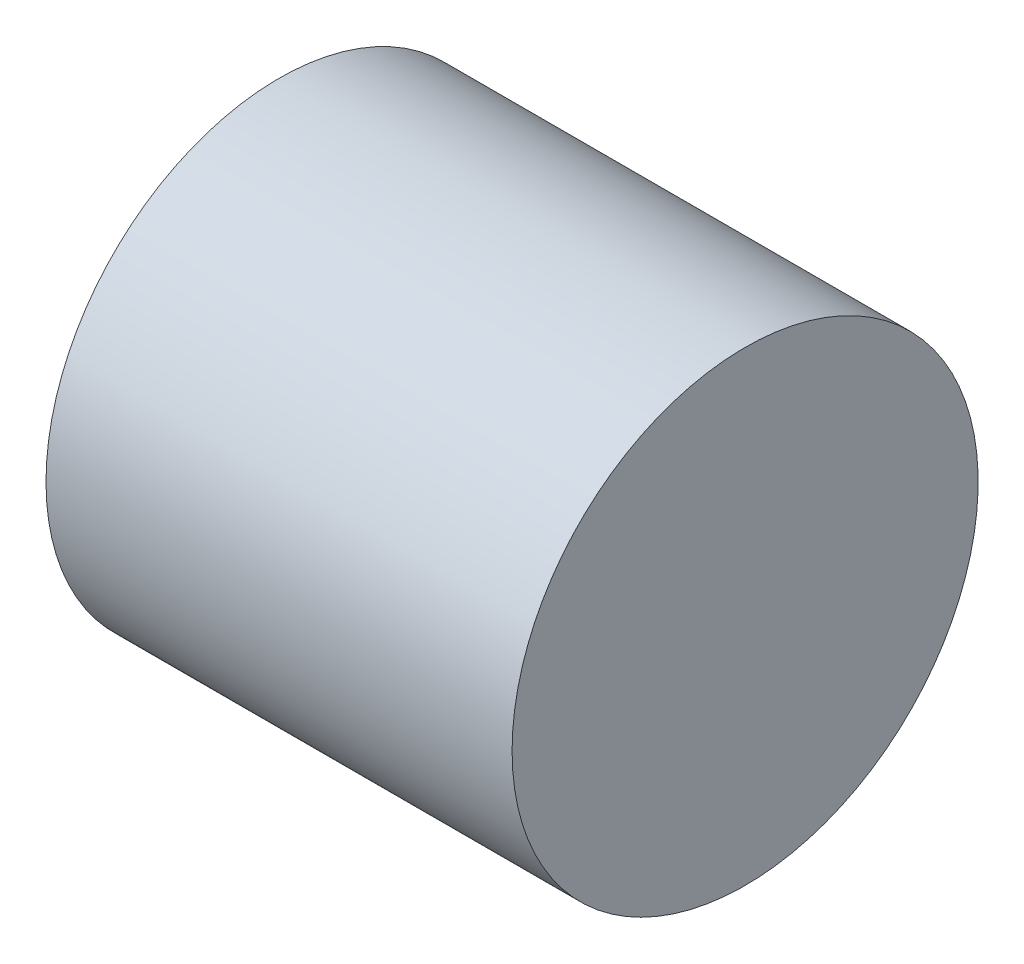
ISO-10303-21;
HEADER;
FILE_DESCRIPTION(('STEP AP214'),'2;1');
FILE_NAME('part.step','',(''),(''),'','','');
FILE_SCHEMA(('AUTOMOTIVE_DESIGN { 1 0 10303 214 1 1 1 1 }'));
ENDSEC;
DATA;
#1=APPLICATION_CONTEXT('core data for automotive mechanical design processes');
#2=APPLICATION_PROTOCOL_DEFINITION('international standard','automotive_design',2000,#1);
#3=PRODUCT_CONTEXT('',#1,'mechanical');
#4=PRODUCT('Part','Part','',(#3));
#5=PRODUCT_RELATED_PRODUCT_CATEGORY('part','',(#4));
#6=PRODUCT_DEFINITION_FORMATION('','',#4);
#7=PRODUCT_DEFINITION_CONTEXT('part definition',#1,'design');
#8=PRODUCT_DEFINITION('design','',#6,#7);
#9=PRODUCT_DEFINITION_SHAPE('','',#8);
#10=(LENGTH_UNIT() NAMED_UNIT(*) SI_UNIT(.MILLI.,.METRE.));
#11=(NAMED_UNIT(*) PLANE_ANGLE_UNIT() SI_UNIT($,.RADIAN.));
#12=(NAMED_UNIT(*) SI_UNIT($,.STERADIAN.) SOLID_ANGLE_UNIT());
#13=UNCERTAINTY_MEASURE_WITH_UNIT(LENGTH_MEASURE(1.E-05),#10,'distance_accuracy_value','');
#14=(GEOMETRIC_REPRESENTATION_CONTEXT(3) GLOBAL_UNCERTAINTY_ASSIGNED_CONTEXT((#13)) GLOBAL_UNIT_ASSIGNED_CONTEXT((#10,
#11,#12)) REPRESENTATION_CONTEXT('',''));
#15=CARTESIAN_POINT('',(0.,0.,0.));
#16=DIRECTION('',(0.,0.,1.));
#17=DIRECTION('',(1.,0.,0.));
#18=AXIS2_PLACEMENT_3D('',#15,#16,#17);
#19=CARTESIAN_POINT('',(-4.47618196809892,20.,0.));
#20=DIRECTION('',(-1.,0.,0.));
#21=DIRECTION('',(0.,0.,1.));
#22=AXIS2_PLACEMENT_3D('',#19,#20,#21);
#23=PLANE('',#22);
#24=CARTESIAN_POINT('',(-4.47618196809892,23.5,0.));
#25=DIRECTION('',(-1.,0.,0.));
#26=DIRECTION('',(0.,0.,1.));
#27=AXIS2_PLACEMENT_3D('',#24,#25,#26);
#28=CIRCLE('',#27,3.5);
#29=CARTESIAN_POINT('',(-4.47618196809892,23.5,3.5));
#30=VERTEX_POINT('',#29);
#31=EDGE_CURVE('E10',#30,#30,#28,.T.);
#32=ORIENTED_EDGE('',*,*,#31,.T.);
#33=EDGE_LOOP('',(#32));
#34=FACE_BOUND('',#33,.T.);
#35=ADVANCED_FACE('F31',(#34),#23,.T.);
#36=CARTESIAN_POINT('',(-6.35520656142087,23.5,0.));
#37=DIRECTION('',(-1.,0.,0.));
#38=DIRECTION('',(0.,0.,1.));
#39=AXIS2_PLACEMENT_3D('',#36,#37,#38);
#40=CYLINDRICAL_SURFACE('',#39,3.5);
#41=CARTESIAN_POINT('',(2.52381803190108,23.5,0.));
#42=DIRECTION('',(-1.,0.,0.));
#43=DIRECTION('',(0.,0.,1.));
#44=AXIS2_PLACEMENT_3D('',#41,#42,#43);
#45=CIRCLE('',#44,3.5);
#46=CARTESIAN_POINT('',(2.52381803190108,23.5,3.5));
#47=VERTEX_POINT('',#46);
#48=EDGE_CURVE('E37',#47,#47,#45,.T.);
#49=ORIENTED_EDGE('',*,*,#48,.T.);
#50=EDGE_LOOP('',(#49));
#51=FACE_BOUND('',#50,.T.);
#52=ORIENTED_EDGE('',*,*,#31,.F.);
#53=EDGE_LOOP('',(#52));
#54=FACE_BOUND('',#53,.T.);
#55=ADVANCED_FACE('F43',(#51,#54),#40,.T.);
#56=CARTESIAN_POINT('',(2.52381803190108,23.5,0.));
#57=DIRECTION('',(1.,0.,0.));
#58=DIRECTION('',(0.,0.,-1.));
#59=AXIS2_PLACEMENT_3D('',#56,#57,#58);
#60=PLANE('',#59);
#61=ORIENTED_EDGE('',*,*,#48,.F.);
#62=EDGE_LOOP('',(#61));
#63=FACE_BOUND('',#62,.T.);
#64=ADVANCED_FACE('F46',(#63),#60,.T.);
#65=CLOSED_SHELL('',(#35,#55,#64));
#66=MANIFOLD_SOLID_BREP('B2',#65);
#67=ADVANCED_BREP_SHAPE_REPRESENTATION('',(#18,#66),#14);
#68=SHAPE_DEFINITION_REPRESENTATION(#9,#67);
ENDSEC;
END-ISO-10303-21;
